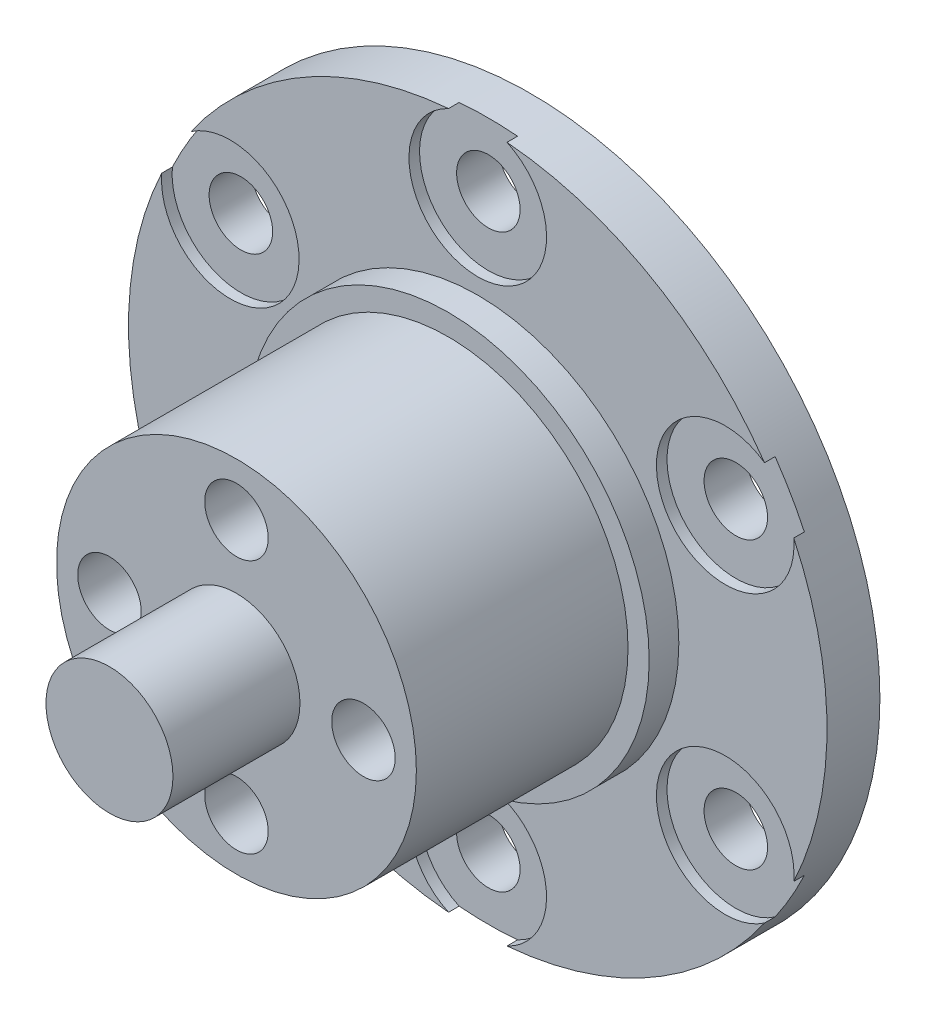
ISO-10303-21;
HEADER;
FILE_DESCRIPTION(('STEP AP214'),'2;1');
FILE_NAME('part.step','',(''),(''),'','','');
FILE_SCHEMA(('AUTOMOTIVE_DESIGN { 1 0 10303 214 1 1 1 1 }'));
ENDSEC;
DATA;
#1=APPLICATION_CONTEXT('core data for automotive mechanical design processes');
#2=APPLICATION_PROTOCOL_DEFINITION('international standard','automotive_design',2000,#1);
#3=PRODUCT_CONTEXT('',#1,'mechanical');
#4=PRODUCT('Part','Part','',(#3));
#5=PRODUCT_RELATED_PRODUCT_CATEGORY('part','',(#4));
#6=PRODUCT_DEFINITION_FORMATION('','',#4);
#7=PRODUCT_DEFINITION_CONTEXT('part definition',#1,'design');
#8=PRODUCT_DEFINITION('design','',#6,#7);
#9=PRODUCT_DEFINITION_SHAPE('','',#8);
#10=(LENGTH_UNIT() NAMED_UNIT(*) SI_UNIT(.MILLI.,.METRE.));
#11=(NAMED_UNIT(*) PLANE_ANGLE_UNIT() SI_UNIT($,.RADIAN.));
#12=(NAMED_UNIT(*) SI_UNIT($,.STERADIAN.) SOLID_ANGLE_UNIT());
#13=UNCERTAINTY_MEASURE_WITH_UNIT(LENGTH_MEASURE(1.E-05),#10,'distance_accuracy_value','');
#14=(GEOMETRIC_REPRESENTATION_CONTEXT(3) GLOBAL_UNCERTAINTY_ASSIGNED_CONTEXT((#13)) GLOBAL_UNIT_ASSIGNED_CONTEXT((#10,
#11,#12)) REPRESENTATION_CONTEXT('',''));
#15=CARTESIAN_POINT('',(0.,0.,0.));
#16=DIRECTION('',(0.,0.,1.));
#17=DIRECTION('',(1.,0.,0.));
#18=AXIS2_PLACEMENT_3D('',#15,#16,#17);
#19=CARTESIAN_POINT('',(11.6913429510899,6.75000000000001,-0.5));
#20=DIRECTION('',(0.,0.,1.));
#21=DIRECTION('',(1.,0.,0.));
#22=AXIS2_PLACEMENT_3D('',#19,#20,#21);
#23=CYLINDRICAL_SURFACE('',#22,1.5);
#24=CARTESIAN_POINT('',(11.6913429510899,6.75000000000001,0.));
#25=DIRECTION('',(0.,0.,1.));
#26=DIRECTION('',(1.,0.,0.));
#27=AXIS2_PLACEMENT_3D('',#24,#25,#26);
#28=CIRCLE('',#27,1.5);
#29=CARTESIAN_POINT('',(13.1913429510899,6.75000000000001,0.));
#30=VERTEX_POINT('',#29);
#31=EDGE_CURVE('E193',#30,#30,#28,.T.);
#32=ORIENTED_EDGE('',*,*,#31,.F.);
#33=EDGE_LOOP('',(#32));
#34=FACE_BOUND('',#33,.T.);
#35=CARTESIAN_POINT('',(11.6913429510899,6.75000000000001,2.));
#36=DIRECTION('',(0.,0.,1.));
#37=DIRECTION('',(1.,0.,0.));
#38=AXIS2_PLACEMENT_3D('',#35,#36,#37);
#39=CIRCLE('',#38,1.5);
#40=CARTESIAN_POINT('',(13.1913429510899,6.75000000000001,2.));
#41=VERTEX_POINT('',#40);
#42=EDGE_CURVE('E45',#41,#41,#39,.F.);
#43=ORIENTED_EDGE('',*,*,#42,.F.);
#44=EDGE_LOOP('',(#43));
#45=FACE_BOUND('',#44,.T.);
#46=ADVANCED_FACE('F41',(#34,#45),#23,.F.);
#47=CARTESIAN_POINT('',(11.6913429510899,-6.75,-0.5));
#48=DIRECTION('',(0.,0.,1.));
#49=DIRECTION('',(1.,0.,0.));
#50=AXIS2_PLACEMENT_3D('',#47,#48,#49);
#51=CYLINDRICAL_SURFACE('',#50,1.5);
#52=CARTESIAN_POINT('',(11.6913429510899,-6.75,0.));
#53=DIRECTION('',(0.,0.,1.));
#54=DIRECTION('',(1.,0.,0.));
#55=AXIS2_PLACEMENT_3D('',#52,#53,#54);
#56=CIRCLE('',#55,1.5);
#57=CARTESIAN_POINT('',(13.1913429510899,-6.75,0.));
#58=VERTEX_POINT('',#57);
#59=EDGE_CURVE('E196',#58,#58,#56,.T.);
#60=ORIENTED_EDGE('',*,*,#59,.F.);
#61=EDGE_LOOP('',(#60));
#62=FACE_BOUND('',#61,.T.);
#63=CARTESIAN_POINT('',(11.6913429510899,-6.75,2.));
#64=DIRECTION('',(0.,0.,1.));
#65=DIRECTION('',(1.,0.,0.));
#66=AXIS2_PLACEMENT_3D('',#63,#64,#65);
#67=CIRCLE('',#66,1.5);
#68=CARTESIAN_POINT('',(13.1913429510899,-6.75,2.));
#69=VERTEX_POINT('',#68);
#70=EDGE_CURVE('E225',#69,#69,#67,.F.);
#71=ORIENTED_EDGE('',*,*,#70,.F.);
#72=EDGE_LOOP('',(#71));
#73=FACE_BOUND('',#72,.T.);
#74=ADVANCED_FACE('F327',(#62,#73),#51,.F.);
#75=CARTESIAN_POINT('',(0.,-13.5,-0.5));
#76=DIRECTION('',(0.,0.,1.));
#77=DIRECTION('',(1.,0.,0.));
#78=AXIS2_PLACEMENT_3D('',#75,#76,#77);
#79=CYLINDRICAL_SURFACE('',#78,1.5);
#80=CARTESIAN_POINT('',(0.,-13.5,0.));
#81=DIRECTION('',(0.,0.,1.));
#82=DIRECTION('',(1.,0.,0.));
#83=AXIS2_PLACEMENT_3D('',#80,#81,#82);
#84=CIRCLE('',#83,1.5);
#85=CARTESIAN_POINT('',(1.5,-13.5,0.));
#86=VERTEX_POINT('',#85);
#87=EDGE_CURVE('E200',#86,#86,#84,.T.);
#88=ORIENTED_EDGE('',*,*,#87,.F.);
#89=EDGE_LOOP('',(#88));
#90=FACE_BOUND('',#89,.T.);
#91=CARTESIAN_POINT('',(0.,-13.5,2.));
#92=DIRECTION('',(0.,0.,1.));
#93=DIRECTION('',(1.,0.,0.));
#94=AXIS2_PLACEMENT_3D('',#91,#92,#93);
#95=CIRCLE('',#94,1.5);
#96=CARTESIAN_POINT('',(1.5,-13.5,2.));
#97=VERTEX_POINT('',#96);
#98=EDGE_CURVE('E222',#97,#97,#95,.F.);
#99=ORIENTED_EDGE('',*,*,#98,.F.);
#100=EDGE_LOOP('',(#99));
#101=FACE_BOUND('',#100,.T.);
#102=ADVANCED_FACE('F333',(#90,#101),#79,.F.);
#103=CARTESIAN_POINT('',(-11.6913429510899,-6.75000000000001,-0.5));
#104=DIRECTION('',(0.,0.,1.));
#105=DIRECTION('',(1.,0.,0.));
#106=AXIS2_PLACEMENT_3D('',#103,#104,#105);
#107=CYLINDRICAL_SURFACE('',#106,1.5);
#108=CARTESIAN_POINT('',(-11.6913429510899,-6.75000000000001,0.));
#109=DIRECTION('',(0.,0.,1.));
#110=DIRECTION('',(1.,0.,0.));
#111=AXIS2_PLACEMENT_3D('',#108,#109,#110);
#112=CIRCLE('',#111,1.5);
#113=CARTESIAN_POINT('',(-10.1913429510899,-6.75000000000001,0.));
#114=VERTEX_POINT('',#113);
#115=EDGE_CURVE('E203',#114,#114,#112,.T.);
#116=ORIENTED_EDGE('',*,*,#115,.F.);
#117=EDGE_LOOP('',(#116));
#118=FACE_BOUND('',#117,.T.);
#119=CARTESIAN_POINT('',(-11.6913429510899,-6.75000000000001,2.));
#120=DIRECTION('',(0.,0.,1.));
#121=DIRECTION('',(1.,0.,0.));
#122=AXIS2_PLACEMENT_3D('',#119,#120,#121);
#123=CIRCLE('',#122,1.5);
#124=CARTESIAN_POINT('',(-10.1913429510899,-6.75000000000001,2.));
#125=VERTEX_POINT('',#124);
#126=EDGE_CURVE('E218',#125,#125,#123,.F.);
#127=ORIENTED_EDGE('',*,*,#126,.F.);
#128=EDGE_LOOP('',(#127));
#129=FACE_BOUND('',#128,.T.);
#130=ADVANCED_FACE('F344',(#118,#129),#107,.F.);
#131=CARTESIAN_POINT('',(-11.6913429510899,6.74999999999999,-0.5));
#132=DIRECTION('',(0.,0.,1.));
#133=DIRECTION('',(1.,0.,0.));
#134=AXIS2_PLACEMENT_3D('',#131,#132,#133);
#135=CYLINDRICAL_SURFACE('',#134,1.5);
#136=CARTESIAN_POINT('',(-11.6913429510899,6.74999999999999,0.));
#137=DIRECTION('',(0.,0.,1.));
#138=DIRECTION('',(1.,0.,0.));
#139=AXIS2_PLACEMENT_3D('',#136,#137,#138);
#140=CIRCLE('',#139,1.5);
#141=CARTESIAN_POINT('',(-10.1913429510899,6.74999999999999,0.));
#142=VERTEX_POINT('',#141);
#143=EDGE_CURVE('E206',#142,#142,#140,.T.);
#144=ORIENTED_EDGE('',*,*,#143,.F.);
#145=EDGE_LOOP('',(#144));
#146=FACE_BOUND('',#145,.T.);
#147=CARTESIAN_POINT('',(-11.6913429510899,6.74999999999999,2.));
#148=DIRECTION('',(0.,0.,1.));
#149=DIRECTION('',(1.,0.,0.));
#150=AXIS2_PLACEMENT_3D('',#147,#148,#149);
#151=CIRCLE('',#150,1.5);
#152=CARTESIAN_POINT('',(-10.1913429510899,6.74999999999999,2.));
#153=VERTEX_POINT('',#152);
#154=EDGE_CURVE('E214',#153,#153,#151,.F.);
#155=ORIENTED_EDGE('',*,*,#154,.F.);
#156=EDGE_LOOP('',(#155));
#157=FACE_BOUND('',#156,.T.);
#158=ADVANCED_FACE('F339',(#146,#157),#135,.F.);
#159=CARTESIAN_POINT('',(0.,13.5,-0.5));
#160=DIRECTION('',(0.,0.,1.));
#161=DIRECTION('',(1.,0.,0.));
#162=AXIS2_PLACEMENT_3D('',#159,#160,#161);
#163=CYLINDRICAL_SURFACE('',#162,1.5);
#164=CARTESIAN_POINT('',(0.,13.5,0.));
#165=DIRECTION('',(0.,0.,1.));
#166=DIRECTION('',(1.,0.,0.));
#167=AXIS2_PLACEMENT_3D('',#164,#165,#166);
#168=CIRCLE('',#167,1.5);
#169=CARTESIAN_POINT('',(1.5,13.5,0.));
#170=VERTEX_POINT('',#169);
#171=EDGE_CURVE('E190',#170,#170,#168,.T.);
#172=ORIENTED_EDGE('',*,*,#171,.F.);
#173=EDGE_LOOP('',(#172));
#174=FACE_BOUND('',#173,.T.);
#175=CARTESIAN_POINT('',(0.,13.5,2.));
#176=DIRECTION('',(0.,0.,1.));
#177=DIRECTION('',(1.,0.,0.));
#178=AXIS2_PLACEMENT_3D('',#175,#176,#177);
#179=CIRCLE('',#178,1.5);
#180=CARTESIAN_POINT('',(1.5,13.5,2.));
#181=VERTEX_POINT('',#180);
#182=EDGE_CURVE('E211',#181,#181,#179,.F.);
#183=ORIENTED_EDGE('',*,*,#182,.F.);
#184=EDGE_LOOP('',(#183));
#185=FACE_BOUND('',#184,.T.);
#186=ADVANCED_FACE('F325',(#174,#185),#163,.F.);
#187=CARTESIAN_POINT('',(0.,0.,2.5));
#188=DIRECTION('',(0.,0.,-1.));
#189=DIRECTION('',(-1.,0.,0.));
#190=AXIS2_PLACEMENT_3D('',#187,#188,#189);
#191=CYLINDRICAL_SURFACE('',#190,16.5);
#192=CARTESIAN_POINT('',(0.,0.,2.));
#193=DIRECTION('',(0.,0.,1.));
#194=DIRECTION('',(1.,0.,0.));
#195=AXIS2_PLACEMENT_3D('',#192,#193,#194);
#196=CIRCLE('',#195,16.5);
#197=CARTESIAN_POINT('',(1.38071475781764,16.4421296296296,2.));
#198=VERTEX_POINT('',#197);
#199=CARTESIAN_POINT('',(-1.38071475781764,16.4421296296296,2.));
#200=VERTEX_POINT('',#199);
#201=EDGE_CURVE('E166',#198,#200,#196,.T.);
#202=ORIENTED_EDGE('',*,*,#201,.F.);
#203=DIRECTION('',(0.,0.,1.));
#204=VECTOR('',#203,1.);
#205=CARTESIAN_POINT('',(1.38071475781765,16.4421296296296,2.25));
#206=LINE('',#205,#204);
#207=CARTESIAN_POINT('',(1.38071475781765,16.4421296296296,2.5));
#208=VERTEX_POINT('',#207);
#209=EDGE_CURVE('E149',#198,#208,#206,.T.);
#210=ORIENTED_EDGE('',*,*,#209,.T.);
#211=CARTESIAN_POINT('',(0.,0.,2.5));
#212=DIRECTION('',(0.,0.,1.));
#213=DIRECTION('',(1.,0.,0.));
#214=AXIS2_PLACEMENT_3D('',#211,#212,#213);
#215=CIRCLE('',#214,16.5);
#216=CARTESIAN_POINT('',(13.5489445726673,9.41679887046495,2.5));
#217=VERTEX_POINT('',#216);
#218=EDGE_CURVE('E165',#217,#208,#215,.T.);
#219=ORIENTED_EDGE('',*,*,#218,.F.);
#220=DIRECTION('',(0.,0.,1.));
#221=VECTOR('',#220,1.);
#222=CARTESIAN_POINT('',(13.5489445726673,9.41679887046496,2.25));
#223=LINE('',#222,#221);
#224=CARTESIAN_POINT('',(13.5489445726673,9.41679887046497,2.));
#225=VERTEX_POINT('',#224);
#226=EDGE_CURVE('E240',#217,#225,#223,.F.);
#227=ORIENTED_EDGE('',*,*,#226,.T.);
#228=CARTESIAN_POINT('',(0.,0.,2.));
#229=DIRECTION('',(0.,0.,1.));
#230=DIRECTION('',(1.,0.,0.));
#231=AXIS2_PLACEMENT_3D('',#228,#229,#230);
#232=CIRCLE('',#231,16.5);
#233=CARTESIAN_POINT('',(14.9296593304849,7.02533075916467,2.));
#234=VERTEX_POINT('',#233);
#235=EDGE_CURVE('E238',#234,#225,#232,.T.);
#236=ORIENTED_EDGE('',*,*,#235,.F.);
#237=DIRECTION('',(0.,0.,1.));
#238=VECTOR('',#237,1.);
#239=CARTESIAN_POINT('',(14.9296593304849,7.02533075916469,2.25));
#240=LINE('',#239,#238);
#241=CARTESIAN_POINT('',(14.9296593304849,7.02533075916469,2.5));
#242=VERTEX_POINT('',#241);
#243=EDGE_CURVE('E242',#234,#242,#240,.T.);
#244=ORIENTED_EDGE('',*,*,#243,.T.);
#245=CARTESIAN_POINT('',(14.9296593304849,-7.02533075916464,2.5));
#246=VERTEX_POINT('',#245);
#247=EDGE_CURVE('E176',#246,#242,#215,.T.);
#248=ORIENTED_EDGE('',*,*,#247,.F.);
#249=DIRECTION('',(0.,0.,1.));
#250=VECTOR('',#249,1.);
#251=CARTESIAN_POINT('',(14.9296593304849,-7.02533075916464,2.25));
#252=LINE('',#251,#250);
#253=CARTESIAN_POINT('',(14.9296593304849,-7.02533075916465,2.));
#254=VERTEX_POINT('',#253);
#255=EDGE_CURVE('E58',#246,#254,#252,.F.);
#256=ORIENTED_EDGE('',*,*,#255,.T.);
#257=CARTESIAN_POINT('',(0.,0.,2.));
#258=DIRECTION('',(0.,0.,1.));
#259=DIRECTION('',(1.,0.,0.));
#260=AXIS2_PLACEMENT_3D('',#257,#258,#259);
#261=CIRCLE('',#260,16.5);
#262=CARTESIAN_POINT('',(13.5489445726673,-9.41679887046497,2.));
#263=VERTEX_POINT('',#262);
#264=EDGE_CURVE('E227',#263,#254,#261,.T.);
#265=ORIENTED_EDGE('',*,*,#264,.F.);
#266=DIRECTION('',(0.,0.,1.));
#267=VECTOR('',#266,1.);
#268=CARTESIAN_POINT('',(13.5489445726673,-9.41679887046498,2.25));
#269=LINE('',#268,#267);
#270=CARTESIAN_POINT('',(13.5489445726673,-9.41679887046498,2.5));
#271=VERTEX_POINT('',#270);
#272=EDGE_CURVE('E246',#263,#271,#269,.T.);
#273=ORIENTED_EDGE('',*,*,#272,.T.);
#274=CARTESIAN_POINT('',(1.38071475781766,-16.4421296296296,2.5));
#275=VERTEX_POINT('',#274);
#276=EDGE_CURVE('E181',#275,#271,#215,.T.);
#277=ORIENTED_EDGE('',*,*,#276,.F.);
#278=DIRECTION('',(0.,0.,1.));
#279=VECTOR('',#278,1.);
#280=CARTESIAN_POINT('',(1.38071475781766,-16.4421296296296,2.25));
#281=LINE('',#280,#279);
#282=CARTESIAN_POINT('',(1.38071475781764,-16.4421296296296,2.));
#283=VERTEX_POINT('',#282);
#284=EDGE_CURVE('E66',#275,#283,#281,.F.);
#285=ORIENTED_EDGE('',*,*,#284,.T.);
#286=CARTESIAN_POINT('',(0.,0.,2.));
#287=DIRECTION('',(0.,0.,1.));
#288=DIRECTION('',(1.,0.,0.));
#289=AXIS2_PLACEMENT_3D('',#286,#287,#288);
#290=CIRCLE('',#289,16.5);
#291=CARTESIAN_POINT('',(-1.38071475781763,-16.4421296296296,2.));
#292=VERTEX_POINT('',#291);
#293=EDGE_CURVE('E224',#292,#283,#290,.T.);
#294=ORIENTED_EDGE('',*,*,#293,.F.);
#295=DIRECTION('',(0.,0.,1.));
#296=VECTOR('',#295,1.);
#297=CARTESIAN_POINT('',(-1.38071475781765,-16.4421296296296,2.25));
#298=LINE('',#297,#296);
#299=CARTESIAN_POINT('',(-1.38071475781765,-16.4421296296296,2.5));
#300=VERTEX_POINT('',#299);
#301=EDGE_CURVE('E250',#292,#300,#298,.T.);
#302=ORIENTED_EDGE('',*,*,#301,.T.);
#303=CARTESIAN_POINT('',(-13.5489445726672,-9.41679887046499,2.5));
#304=VERTEX_POINT('',#303);
#305=EDGE_CURVE('E185',#304,#300,#215,.T.);
#306=ORIENTED_EDGE('',*,*,#305,.F.);
#307=DIRECTION('',(0.,0.,1.));
#308=VECTOR('',#307,1.);
#309=CARTESIAN_POINT('',(-13.5489445726672,-9.41679887046499,2.25));
#310=LINE('',#309,#308);
#311=CARTESIAN_POINT('',(-13.5489445726673,-9.41679887046498,2.));
#312=VERTEX_POINT('',#311);
#313=EDGE_CURVE('E253',#304,#312,#310,.F.);
#314=ORIENTED_EDGE('',*,*,#313,.T.);
#315=CARTESIAN_POINT('',(0.,0.,2.));
#316=DIRECTION('',(0.,0.,1.));
#317=DIRECTION('',(1.,0.,0.));
#318=AXIS2_PLACEMENT_3D('',#315,#316,#317);
#319=CIRCLE('',#318,16.5);
#320=CARTESIAN_POINT('',(-14.9296593304849,-7.02533075916467,2.));
#321=VERTEX_POINT('',#320);
#322=EDGE_CURVE('E221',#321,#312,#319,.T.);
#323=ORIENTED_EDGE('',*,*,#322,.F.);
#324=DIRECTION('',(0.,0.,1.));
#325=VECTOR('',#324,1.);
#326=CARTESIAN_POINT('',(-14.9296593304849,-7.02533075916465,2.25));
#327=LINE('',#326,#325);
#328=CARTESIAN_POINT('',(-14.9296593304849,-7.02533075916465,2.5));
#329=VERTEX_POINT('',#328);
#330=EDGE_CURVE('E256',#321,#329,#327,.T.);
#331=ORIENTED_EDGE('',*,*,#330,.T.);
#332=CARTESIAN_POINT('',(-14.9296593304849,7.02533075916463,2.5));
#333=VERTEX_POINT('',#332);
#334=EDGE_CURVE('E179',#333,#329,#215,.T.);
#335=ORIENTED_EDGE('',*,*,#334,.F.);
#336=DIRECTION('',(0.,0.,1.));
#337=VECTOR('',#336,1.);
#338=CARTESIAN_POINT('',(-14.9296593304849,7.02533075916463,2.25));
#339=LINE('',#338,#337);
#340=CARTESIAN_POINT('',(-14.9296593304849,7.02533075916465,2.));
#341=VERTEX_POINT('',#340);
#342=EDGE_CURVE('E259',#333,#341,#339,.F.);
#343=ORIENTED_EDGE('',*,*,#342,.T.);
#344=CARTESIAN_POINT('',(0.,0.,2.));
#345=DIRECTION('',(0.,0.,1.));
#346=DIRECTION('',(1.,0.,0.));
#347=AXIS2_PLACEMENT_3D('',#344,#345,#346);
#348=CIRCLE('',#347,16.5);
#349=CARTESIAN_POINT('',(-13.5489445726673,9.41679887046495,2.));
#350=VERTEX_POINT('',#349);
#351=EDGE_CURVE('E217',#350,#341,#348,.T.);
#352=ORIENTED_EDGE('',*,*,#351,.F.);
#353=DIRECTION('',(0.,0.,1.));
#354=VECTOR('',#353,1.);
#355=CARTESIAN_POINT('',(-13.5489445726673,9.41679887046497,2.25));
#356=LINE('',#355,#354);
#357=CARTESIAN_POINT('',(-13.5489445726673,9.41679887046497,2.5));
#358=VERTEX_POINT('',#357);
#359=EDGE_CURVE('E262',#350,#358,#356,.T.);
#360=ORIENTED_EDGE('',*,*,#359,.T.);
#361=CARTESIAN_POINT('',(-1.38071475781766,16.4421296296296,2.5));
#362=VERTEX_POINT('',#361);
#363=EDGE_CURVE('E174',#362,#358,#215,.T.);
#364=ORIENTED_EDGE('',*,*,#363,.F.);
#365=DIRECTION('',(0.,0.,1.));
#366=VECTOR('',#365,1.);
#367=CARTESIAN_POINT('',(-1.38071475781765,16.4421296296296,2.25));
#368=LINE('',#367,#366);
#369=EDGE_CURVE('E152',#362,#200,#368,.F.);
#370=ORIENTED_EDGE('',*,*,#369,.T.);
#371=EDGE_LOOP('',(#202,#210,#219,#227,#236,#244,#248,#256,#265,#273,#277,#285,#294,#302,#306,
#314,#323,#331,#335,#343,#352,#360,#364,#370));
#372=FACE_BOUND('',#371,.T.);
#373=CARTESIAN_POINT('',(0.,0.,0.));
#374=DIRECTION('',(0.,0.,1.));
#375=DIRECTION('',(1.,0.,0.));
#376=AXIS2_PLACEMENT_3D('',#373,#374,#375);
#377=CIRCLE('',#376,16.5);
#378=CARTESIAN_POINT('',(16.5,0.,0.));
#379=VERTEX_POINT('',#378);
#380=EDGE_CURVE('E182',#379,#379,#377,.T.);
#381=ORIENTED_EDGE('',*,*,#380,.T.);
#382=EDGE_LOOP('',(#381));
#383=FACE_BOUND('',#382,.T.);
#384=ADVANCED_FACE('F43',(#372,#383),#191,.T.);
#385=CARTESIAN_POINT('',(0.,0.,2.5));
#386=DIRECTION('',(0.,0.,1.));
#387=DIRECTION('',(1.,0.,0.));
#388=AXIS2_PLACEMENT_3D('',#385,#386,#387);
#389=PLANE('',#388);
#390=CARTESIAN_POINT('',(0.,13.5,2.5));
#391=DIRECTION('',(0.,0.,1.));
#392=DIRECTION('',(1.,0.,0.));
#393=AXIS2_PLACEMENT_3D('',#390,#391,#392);
#394=CIRCLE('',#393,3.25);
#395=EDGE_CURVE('E145',#362,#208,#394,.T.);
#396=ORIENTED_EDGE('',*,*,#395,.F.);
#397=ORIENTED_EDGE('',*,*,#363,.T.);
#398=CARTESIAN_POINT('',(-11.6913429510899,6.74999999999999,2.5));
#399=DIRECTION('',(0.,0.,1.));
#400=DIRECTION('',(1.,0.,0.));
#401=AXIS2_PLACEMENT_3D('',#398,#399,#400);
#402=CIRCLE('',#401,3.25);
#403=EDGE_CURVE('E376',#333,#358,#402,.T.);
#404=ORIENTED_EDGE('',*,*,#403,.F.);
#405=ORIENTED_EDGE('',*,*,#334,.T.);
#406=CARTESIAN_POINT('',(-11.6913429510899,-6.75000000000001,2.5));
#407=DIRECTION('',(0.,0.,1.));
#408=DIRECTION('',(1.,0.,0.));
#409=AXIS2_PLACEMENT_3D('',#406,#407,#408);
#410=CIRCLE('',#409,3.25);
#411=EDGE_CURVE('E369',#304,#329,#410,.T.);
#412=ORIENTED_EDGE('',*,*,#411,.F.);
#413=ORIENTED_EDGE('',*,*,#305,.T.);
#414=CARTESIAN_POINT('',(0.,-13.5,2.5));
#415=DIRECTION('',(0.,0.,1.));
#416=DIRECTION('',(1.,0.,0.));
#417=AXIS2_PLACEMENT_3D('',#414,#415,#416);
#418=CIRCLE('',#417,3.25);
#419=EDGE_CURVE('E368',#275,#300,#418,.T.);
#420=ORIENTED_EDGE('',*,*,#419,.F.);
#421=ORIENTED_EDGE('',*,*,#276,.T.);
#422=CARTESIAN_POINT('',(11.6913429510899,-6.75,2.5));
#423=DIRECTION('',(0.,0.,1.));
#424=DIRECTION('',(1.,0.,0.));
#425=AXIS2_PLACEMENT_3D('',#422,#423,#424);
#426=CIRCLE('',#425,3.25);
#427=EDGE_CURVE('E395',#246,#271,#426,.T.);
#428=ORIENTED_EDGE('',*,*,#427,.F.);
#429=ORIENTED_EDGE('',*,*,#247,.T.);
#430=CARTESIAN_POINT('',(11.6913429510899,6.75000000000001,2.5));
#431=DIRECTION('',(0.,0.,1.));
#432=DIRECTION('',(1.,0.,0.));
#433=AXIS2_PLACEMENT_3D('',#430,#431,#432);
#434=CIRCLE('',#433,3.25);
#435=EDGE_CURVE('E173',#217,#242,#434,.T.);
#436=ORIENTED_EDGE('',*,*,#435,.F.);
#437=ORIENTED_EDGE('',*,*,#218,.T.);
#438=EDGE_LOOP('',(#396,#397,#404,#405,#412,#413,#420,#421,#428,#429,#436,#437));
#439=FACE_BOUND('',#438,.T.);
#440=CARTESIAN_POINT('',(0.,0.,2.5));
#441=DIRECTION('',(0.,0.,1.));
#442=DIRECTION('',(1.,0.,0.));
#443=AXIS2_PLACEMENT_3D('',#440,#441,#442);
#444=CIRCLE('',#443,9.5);
#445=CARTESIAN_POINT('',(9.5,0.,2.5));
#446=VERTEX_POINT('',#445);
#447=EDGE_CURVE('E50',#446,#446,#444,.T.);
#448=ORIENTED_EDGE('',*,*,#447,.F.);
#449=EDGE_LOOP('',(#448));
#450=FACE_BOUND('',#449,.T.);
#451=ADVANCED_FACE('F170',(#439,#450),#389,.T.);
#452=CARTESIAN_POINT('',(0.,0.,0.));
#453=DIRECTION('',(0.,0.,1.));
#454=DIRECTION('',(1.,0.,0.));
#455=AXIS2_PLACEMENT_3D('',#452,#453,#454);
#456=PLANE('',#455);
#457=ORIENTED_EDGE('',*,*,#171,.T.);
#458=EDGE_LOOP('',(#457));
#459=FACE_BOUND('',#458,.T.);
#460=ORIENTED_EDGE('',*,*,#143,.T.);
#461=EDGE_LOOP('',(#460));
#462=FACE_BOUND('',#461,.T.);
#463=ORIENTED_EDGE('',*,*,#115,.T.);
#464=EDGE_LOOP('',(#463));
#465=FACE_BOUND('',#464,.T.);
#466=ORIENTED_EDGE('',*,*,#87,.T.);
#467=EDGE_LOOP('',(#466));
#468=FACE_BOUND('',#467,.T.);
#469=ORIENTED_EDGE('',*,*,#59,.T.);
#470=EDGE_LOOP('',(#469));
#471=FACE_BOUND('',#470,.T.);
#472=ORIENTED_EDGE('',*,*,#31,.T.);
#473=EDGE_LOOP('',(#472));
#474=FACE_BOUND('',#473,.T.);
#475=ORIENTED_EDGE('',*,*,#380,.F.);
#476=EDGE_LOOP('',(#475));
#477=FACE_BOUND('',#476,.T.);
#478=ADVANCED_FACE('F315',(#459,#462,#465,#468,#471,#474,#477),#456,.F.);
#479=CARTESIAN_POINT('',(0.,0.,3.9));
#480=DIRECTION('',(0.,0.,-1.));
#481=DIRECTION('',(-1.,0.,0.));
#482=AXIS2_PLACEMENT_3D('',#479,#480,#481);
#483=CYLINDRICAL_SURFACE('',#482,9.5);
#484=CARTESIAN_POINT('',(0.,0.,3.9));
#485=DIRECTION('',(0.,0.,1.));
#486=DIRECTION('',(1.,0.,0.));
#487=AXIS2_PLACEMENT_3D('',#484,#485,#486);
#488=CIRCLE('',#487,9.5);
#489=CARTESIAN_POINT('',(9.5,0.,3.9));
#490=VERTEX_POINT('',#489);
#491=EDGE_CURVE('E187',#490,#490,#488,.T.);
#492=ORIENTED_EDGE('',*,*,#491,.F.);
#493=EDGE_LOOP('',(#492));
#494=FACE_BOUND('',#493,.T.);
#495=ORIENTED_EDGE('',*,*,#447,.T.);
#496=EDGE_LOOP('',(#495));
#497=FACE_BOUND('',#496,.T.);
#498=ADVANCED_FACE('F309',(#494,#497),#483,.T.);
#499=CARTESIAN_POINT('',(0.,0.,3.9));
#500=DIRECTION('',(0.,0.,1.));
#501=DIRECTION('',(1.,0.,0.));
#502=AXIS2_PLACEMENT_3D('',#499,#500,#501);
#503=PLANE('',#502);
#504=CARTESIAN_POINT('',(0.,0.,3.9));
#505=DIRECTION('',(0.,0.,1.));
#506=DIRECTION('',(1.,0.,0.));
#507=AXIS2_PLACEMENT_3D('',#504,#505,#506);
#508=CIRCLE('',#507,8.5);
#509=CARTESIAN_POINT('',(8.5,0.,3.9));
#510=VERTEX_POINT('',#509);
#511=EDGE_CURVE('E11',#510,#510,#508,.T.);
#512=ORIENTED_EDGE('',*,*,#511,.F.);
#513=EDGE_LOOP('',(#512));
#514=FACE_BOUND('',#513,.T.);
#515=ORIENTED_EDGE('',*,*,#491,.T.);
#516=EDGE_LOOP('',(#515));
#517=FACE_BOUND('',#516,.T.);
#518=ADVANCED_FACE('F303',(#514,#517),#503,.T.);
#519=CARTESIAN_POINT('',(0.,0.,13.9));
#520=DIRECTION('',(0.,0.,-1.));
#521=DIRECTION('',(-1.,0.,0.));
#522=AXIS2_PLACEMENT_3D('',#519,#520,#521);
#523=CYLINDRICAL_SURFACE('',#522,8.5);
#524=CARTESIAN_POINT('',(0.,0.,13.9));
#525=DIRECTION('',(0.,0.,1.));
#526=DIRECTION('',(1.,0.,0.));
#527=AXIS2_PLACEMENT_3D('',#524,#525,#526);
#528=CIRCLE('',#527,8.5);
#529=CARTESIAN_POINT('',(8.5,0.,13.9));
#530=VERTEX_POINT('',#529);
#531=EDGE_CURVE('E197',#530,#530,#528,.T.);
#532=ORIENTED_EDGE('',*,*,#531,.F.);
#533=EDGE_LOOP('',(#532));
#534=FACE_BOUND('',#533,.T.);
#535=ORIENTED_EDGE('',*,*,#511,.T.);
#536=EDGE_LOOP('',(#535));
#537=FACE_BOUND('',#536,.T.);
#538=ADVANCED_FACE('F300',(#534,#537),#523,.T.);
#539=CARTESIAN_POINT('',(0.,0.,13.9));
#540=DIRECTION('',(0.,0.,1.));
#541=DIRECTION('',(1.,0.,0.));
#542=AXIS2_PLACEMENT_3D('',#539,#540,#541);
#543=PLANE('',#542);
#544=CARTESIAN_POINT('',(0.,0.,13.9));
#545=DIRECTION('',(0.,0.,1.));
#546=DIRECTION('',(1.,0.,0.));
#547=AXIS2_PLACEMENT_3D('',#544,#545,#546);
#548=CIRCLE('',#547,3.);
#549=CARTESIAN_POINT('',(3.,0.,13.9));
#550=VERTEX_POINT('',#549);
#551=EDGE_CURVE('E167',#550,#550,#548,.T.);
#552=ORIENTED_EDGE('',*,*,#551,.F.);
#553=EDGE_LOOP('',(#552));
#554=FACE_BOUND('',#553,.T.);
#555=CARTESIAN_POINT('',(6.,0.,13.9));
#556=DIRECTION('',(0.,0.,1.));
#557=DIRECTION('',(1.,0.,0.));
#558=AXIS2_PLACEMENT_3D('',#555,#556,#557);
#559=CIRCLE('',#558,1.49999999999999);
#560=CARTESIAN_POINT('',(7.49999999999999,0.,13.9));
#561=VERTEX_POINT('',#560);
#562=EDGE_CURVE('E269',#561,#561,#559,.T.);
#563=ORIENTED_EDGE('',*,*,#562,.F.);
#564=EDGE_LOOP('',(#563));
#565=FACE_BOUND('',#564,.T.);
#566=CARTESIAN_POINT('',(0.,-6.,13.9));
#567=DIRECTION('',(0.,0.,1.));
#568=DIRECTION('',(1.,0.,0.));
#569=AXIS2_PLACEMENT_3D('',#566,#567,#568);
#570=CIRCLE('',#569,1.49999999999999);
#571=CARTESIAN_POINT('',(1.49999999999999,-6.,13.9));
#572=VERTEX_POINT('',#571);
#573=EDGE_CURVE('E277',#572,#572,#570,.T.);
#574=ORIENTED_EDGE('',*,*,#573,.F.);
#575=EDGE_LOOP('',(#574));
#576=FACE_BOUND('',#575,.T.);
#577=CARTESIAN_POINT('',(-6.,0.,13.9));
#578=DIRECTION('',(0.,0.,1.));
#579=DIRECTION('',(1.,0.,0.));
#580=AXIS2_PLACEMENT_3D('',#577,#578,#579);
#581=CIRCLE('',#580,1.49999999999999);
#582=CARTESIAN_POINT('',(-4.50000000000001,0.,13.9));
#583=VERTEX_POINT('',#582);
#584=EDGE_CURVE('E283',#583,#583,#581,.T.);
#585=ORIENTED_EDGE('',*,*,#584,.F.);
#586=EDGE_LOOP('',(#585));
#587=FACE_BOUND('',#586,.T.);
#588=CARTESIAN_POINT('',(0.,6.,13.9));
#589=DIRECTION('',(0.,0.,1.));
#590=DIRECTION('',(1.,0.,0.));
#591=AXIS2_PLACEMENT_3D('',#588,#589,#590);
#592=CIRCLE('',#591,1.49999999999999);
#593=CARTESIAN_POINT('',(1.49999999999999,6.,13.9));
#594=VERTEX_POINT('',#593);
#595=EDGE_CURVE('E289',#594,#594,#592,.T.);
#596=ORIENTED_EDGE('',*,*,#595,.F.);
#597=EDGE_LOOP('',(#596));
#598=FACE_BOUND('',#597,.T.);
#599=ORIENTED_EDGE('',*,*,#531,.T.);
#600=EDGE_LOOP('',(#599));
#601=FACE_BOUND('',#600,.T.);
#602=ADVANCED_FACE('F298',(#554,#565,#576,#587,#598,#601),#543,.T.);
#603=CARTESIAN_POINT('',(0.,6.,6.39999999999999));
#604=DIRECTION('',(0.,0.,1.));
#605=DIRECTION('',(1.,0.,0.));
#606=AXIS2_PLACEMENT_3D('',#603,#604,#605);
#607=CONICAL_SURFACE('',#606,1.49999999999999,1.02974425867665);
#608=CARTESIAN_POINT('',(0.,6.,5.49870907145866));
#609=VERTEX_POINT('',#608);
#610=VERTEX_LOOP('',#609);
#611=FACE_BOUND('',#610,.T.);
#612=CARTESIAN_POINT('',(0.,6.,6.39999999999999));
#613=DIRECTION('',(0.,0.,1.));
#614=DIRECTION('',(1.,0.,0.));
#615=AXIS2_PLACEMENT_3D('',#612,#613,#614);
#616=CIRCLE('',#615,1.49999999999999);
#617=CARTESIAN_POINT('',(1.49999999999999,6.,6.39999999999999));
#618=VERTEX_POINT('',#617);
#619=EDGE_CURVE('E292',#618,#618,#616,.T.);
#620=ORIENTED_EDGE('',*,*,#619,.T.);
#621=EDGE_LOOP('',(#620));
#622=FACE_BOUND('',#621,.T.);
#623=ADVANCED_FACE('F469',(#611,#622),#607,.F.);
#624=CARTESIAN_POINT('',(0.,6.,13.9));
#625=DIRECTION('',(0.,0.,1.));
#626=DIRECTION('',(1.,0.,0.));
#627=AXIS2_PLACEMENT_3D('',#624,#625,#626);
#628=CYLINDRICAL_SURFACE('',#627,1.49999999999999);
#629=ORIENTED_EDGE('',*,*,#619,.F.);
#630=EDGE_LOOP('',(#629));
#631=FACE_BOUND('',#630,.T.);
#632=ORIENTED_EDGE('',*,*,#595,.T.);
#633=EDGE_LOOP('',(#632));
#634=FACE_BOUND('',#633,.T.);
#635=ADVANCED_FACE('F465',(#631,#634),#628,.F.);
#636=CARTESIAN_POINT('',(-6.,0.,6.39999999999999));
#637=DIRECTION('',(0.,0.,1.));
#638=DIRECTION('',(1.,0.,0.));
#639=AXIS2_PLACEMENT_3D('',#636,#637,#638);
#640=CONICAL_SURFACE('',#639,1.49999999999999,1.02974425867665);
#641=CARTESIAN_POINT('',(-6.,0.,5.49870907145866));
#642=VERTEX_POINT('',#641);
#643=VERTEX_LOOP('',#642);
#644=FACE_BOUND('',#643,.T.);
#645=CARTESIAN_POINT('',(-6.,0.,6.39999999999999));
#646=DIRECTION('',(0.,0.,1.));
#647=DIRECTION('',(1.,0.,0.));
#648=AXIS2_PLACEMENT_3D('',#645,#646,#647);
#649=CIRCLE('',#648,1.49999999999999);
#650=CARTESIAN_POINT('',(-4.50000000000001,0.,6.39999999999999));
#651=VERTEX_POINT('',#650);
#652=EDGE_CURVE('E286',#651,#651,#649,.T.);
#653=ORIENTED_EDGE('',*,*,#652,.T.);
#654=EDGE_LOOP('',(#653));
#655=FACE_BOUND('',#654,.T.);
#656=ADVANCED_FACE('F461',(#644,#655),#640,.F.);
#657=CARTESIAN_POINT('',(-6.,0.,13.9));
#658=DIRECTION('',(0.,0.,1.));
#659=DIRECTION('',(1.,0.,0.));
#660=AXIS2_PLACEMENT_3D('',#657,#658,#659);
#661=CYLINDRICAL_SURFACE('',#660,1.49999999999999);
#662=ORIENTED_EDGE('',*,*,#652,.F.);
#663=EDGE_LOOP('',(#662));
#664=FACE_BOUND('',#663,.T.);
#665=ORIENTED_EDGE('',*,*,#584,.T.);
#666=EDGE_LOOP('',(#665));
#667=FACE_BOUND('',#666,.T.);
#668=ADVANCED_FACE('F457',(#664,#667),#661,.F.);
#669=CARTESIAN_POINT('',(0.,-6.,6.39999999999999));
#670=DIRECTION('',(0.,0.,1.));
#671=DIRECTION('',(1.,0.,0.));
#672=AXIS2_PLACEMENT_3D('',#669,#670,#671);
#673=CONICAL_SURFACE('',#672,1.49999999999999,1.02974425867665);
#674=CARTESIAN_POINT('',(0.,-6.,5.49870907145866));
#675=VERTEX_POINT('',#674);
#676=VERTEX_LOOP('',#675);
#677=FACE_BOUND('',#676,.T.);
#678=CARTESIAN_POINT('',(0.,-6.,6.39999999999999));
#679=DIRECTION('',(0.,0.,1.));
#680=DIRECTION('',(1.,0.,0.));
#681=AXIS2_PLACEMENT_3D('',#678,#679,#680);
#682=CIRCLE('',#681,1.49999999999999);
#683=CARTESIAN_POINT('',(1.49999999999999,-6.,6.39999999999999));
#684=VERTEX_POINT('',#683);
#685=EDGE_CURVE('E280',#684,#684,#682,.T.);
#686=ORIENTED_EDGE('',*,*,#685,.T.);
#687=EDGE_LOOP('',(#686));
#688=FACE_BOUND('',#687,.T.);
#689=ADVANCED_FACE('F453',(#677,#688),#673,.F.);
#690=CARTESIAN_POINT('',(0.,-6.,13.9));
#691=DIRECTION('',(0.,0.,1.));
#692=DIRECTION('',(1.,0.,0.));
#693=AXIS2_PLACEMENT_3D('',#690,#691,#692);
#694=CYLINDRICAL_SURFACE('',#693,1.49999999999999);
#695=ORIENTED_EDGE('',*,*,#685,.F.);
#696=EDGE_LOOP('',(#695));
#697=FACE_BOUND('',#696,.T.);
#698=ORIENTED_EDGE('',*,*,#573,.T.);
#699=EDGE_LOOP('',(#698));
#700=FACE_BOUND('',#699,.T.);
#701=ADVANCED_FACE('F449',(#697,#700),#694,.F.);
#702=CARTESIAN_POINT('',(6.,0.,6.39999999999999));
#703=DIRECTION('',(0.,0.,1.));
#704=DIRECTION('',(1.,0.,0.));
#705=AXIS2_PLACEMENT_3D('',#702,#703,#704);
#706=CONICAL_SURFACE('',#705,1.49999999999999,1.02974425867665);
#707=CARTESIAN_POINT('',(6.,0.,5.49870907145866));
#708=VERTEX_POINT('',#707);
#709=VERTEX_LOOP('',#708);
#710=FACE_BOUND('',#709,.T.);
#711=CARTESIAN_POINT('',(6.,0.,6.39999999999999));
#712=DIRECTION('',(0.,0.,1.));
#713=DIRECTION('',(1.,0.,0.));
#714=AXIS2_PLACEMENT_3D('',#711,#712,#713);
#715=CIRCLE('',#714,1.49999999999999);
#716=CARTESIAN_POINT('',(7.49999999999999,0.,6.39999999999999));
#717=VERTEX_POINT('',#716);
#718=EDGE_CURVE('E274',#717,#717,#715,.T.);
#719=ORIENTED_EDGE('',*,*,#718,.T.);
#720=EDGE_LOOP('',(#719));
#721=FACE_BOUND('',#720,.T.);
#722=ADVANCED_FACE('F445',(#710,#721),#706,.F.);
#723=CARTESIAN_POINT('',(6.,0.,13.9));
#724=DIRECTION('',(0.,0.,1.));
#725=DIRECTION('',(1.,0.,0.));
#726=AXIS2_PLACEMENT_3D('',#723,#724,#725);
#727=CYLINDRICAL_SURFACE('',#726,1.49999999999999);
#728=ORIENTED_EDGE('',*,*,#718,.F.);
#729=EDGE_LOOP('',(#728));
#730=FACE_BOUND('',#729,.T.);
#731=ORIENTED_EDGE('',*,*,#562,.T.);
#732=EDGE_LOOP('',(#731));
#733=FACE_BOUND('',#732,.T.);
#734=ADVANCED_FACE('F441',(#730,#733),#727,.F.);
#735=CARTESIAN_POINT('',(0.,0.,19.9));
#736=DIRECTION('',(0.,0.,-1.));
#737=DIRECTION('',(-1.,0.,0.));
#738=AXIS2_PLACEMENT_3D('',#735,#736,#737);
#739=CYLINDRICAL_SURFACE('',#738,3.);
#740=CARTESIAN_POINT('',(0.,0.,19.9));
#741=DIRECTION('',(0.,0.,1.));
#742=DIRECTION('',(1.,0.,0.));
#743=AXIS2_PLACEMENT_3D('',#740,#741,#742);
#744=CIRCLE('',#743,3.);
#745=CARTESIAN_POINT('',(3.,0.,19.9));
#746=VERTEX_POINT('',#745);
#747=EDGE_CURVE('E266',#746,#746,#744,.T.);
#748=ORIENTED_EDGE('',*,*,#747,.F.);
#749=EDGE_LOOP('',(#748));
#750=FACE_BOUND('',#749,.T.);
#751=ORIENTED_EDGE('',*,*,#551,.T.);
#752=EDGE_LOOP('',(#751));
#753=FACE_BOUND('',#752,.T.);
#754=ADVANCED_FACE('F437',(#750,#753),#739,.T.);
#755=CARTESIAN_POINT('',(0.,0.,19.9));
#756=DIRECTION('',(0.,0.,1.));
#757=DIRECTION('',(1.,0.,0.));
#758=AXIS2_PLACEMENT_3D('',#755,#756,#757);
#759=PLANE('',#758);
#760=ORIENTED_EDGE('',*,*,#747,.T.);
#761=EDGE_LOOP('',(#760));
#762=FACE_BOUND('',#761,.T.);
#763=ADVANCED_FACE('F434',(#762),#759,.T.);
#764=CARTESIAN_POINT('',(0.,13.5,2.));
#765=DIRECTION('',(0.,0.,1.));
#766=DIRECTION('',(1.,0.,0.));
#767=AXIS2_PLACEMENT_3D('',#764,#765,#766);
#768=CYLINDRICAL_SURFACE('',#767,3.25);
#769=CARTESIAN_POINT('',(0.,13.5,2.));
#770=DIRECTION('',(0.,0.,1.));
#771=DIRECTION('',(1.,0.,0.));
#772=AXIS2_PLACEMENT_3D('',#769,#770,#771);
#773=CIRCLE('',#772,3.25);
#774=EDGE_CURVE('E157',#200,#198,#773,.T.);
#775=ORIENTED_EDGE('',*,*,#774,.F.);
#776=ORIENTED_EDGE('',*,*,#369,.F.);
#777=ORIENTED_EDGE('',*,*,#395,.T.);
#778=ORIENTED_EDGE('',*,*,#209,.F.);
#779=EDGE_LOOP('',(#775,#776,#777,#778));
#780=FACE_BOUND('',#779,.T.);
#781=ADVANCED_FACE('F148',(#780),#768,.F.);
#782=CARTESIAN_POINT('',(0.,13.5,2.));
#783=DIRECTION('',(0.,0.,1.));
#784=DIRECTION('',(1.,0.,0.));
#785=AXIS2_PLACEMENT_3D('',#782,#783,#784);
#786=PLANE('',#785);
#787=ORIENTED_EDGE('',*,*,#182,.T.);
#788=EDGE_LOOP('',(#787));
#789=FACE_BOUND('',#788,.T.);
#790=ORIENTED_EDGE('',*,*,#201,.T.);
#791=ORIENTED_EDGE('',*,*,#774,.T.);
#792=EDGE_LOOP('',(#790,#791));
#793=FACE_BOUND('',#792,.T.);
#794=ADVANCED_FACE('F409',(#789,#793),#786,.T.);
#795=CARTESIAN_POINT('',(-11.6913429510899,6.74999999999999,2.));
#796=DIRECTION('',(0.,0.,1.));
#797=DIRECTION('',(1.,0.,0.));
#798=AXIS2_PLACEMENT_3D('',#795,#796,#797);
#799=CYLINDRICAL_SURFACE('',#798,3.25);
#800=CARTESIAN_POINT('',(-11.6913429510899,6.74999999999999,2.));
#801=DIRECTION('',(0.,0.,1.));
#802=DIRECTION('',(1.,0.,0.));
#803=AXIS2_PLACEMENT_3D('',#800,#801,#802);
#804=CIRCLE('',#803,3.25);
#805=EDGE_CURVE('E382',#341,#350,#804,.T.);
#806=ORIENTED_EDGE('',*,*,#805,.F.);
#807=ORIENTED_EDGE('',*,*,#342,.F.);
#808=ORIENTED_EDGE('',*,*,#403,.T.);
#809=ORIENTED_EDGE('',*,*,#359,.F.);
#810=EDGE_LOOP('',(#806,#807,#808,#809));
#811=FACE_BOUND('',#810,.T.);
#812=ADVANCED_FACE('F380',(#811),#799,.F.);
#813=CARTESIAN_POINT('',(-11.6913429510899,6.74999999999999,2.));
#814=DIRECTION('',(0.,0.,1.));
#815=DIRECTION('',(1.,0.,0.));
#816=AXIS2_PLACEMENT_3D('',#813,#814,#815);
#817=PLANE('',#816);
#818=ORIENTED_EDGE('',*,*,#154,.T.);
#819=EDGE_LOOP('',(#818));
#820=FACE_BOUND('',#819,.T.);
#821=ORIENTED_EDGE('',*,*,#351,.T.);
#822=ORIENTED_EDGE('',*,*,#805,.T.);
#823=EDGE_LOOP('',(#821,#822));
#824=FACE_BOUND('',#823,.T.);
#825=ADVANCED_FACE('F400',(#820,#824),#817,.T.);
#826=CARTESIAN_POINT('',(-11.6913429510899,-6.75000000000001,2.));
#827=DIRECTION('',(0.,0.,1.));
#828=DIRECTION('',(1.,0.,0.));
#829=AXIS2_PLACEMENT_3D('',#826,#827,#828);
#830=CYLINDRICAL_SURFACE('',#829,3.25);
#831=CARTESIAN_POINT('',(-11.6913429510899,-6.75000000000001,2.));
#832=DIRECTION('',(0.,0.,1.));
#833=DIRECTION('',(1.,0.,0.));
#834=AXIS2_PLACEMENT_3D('',#831,#832,#833);
#835=CIRCLE('',#834,3.25);
#836=EDGE_CURVE('E365',#312,#321,#835,.T.);
#837=ORIENTED_EDGE('',*,*,#836,.F.);
#838=ORIENTED_EDGE('',*,*,#313,.F.);
#839=ORIENTED_EDGE('',*,*,#411,.T.);
#840=ORIENTED_EDGE('',*,*,#330,.F.);
#841=EDGE_LOOP('',(#837,#838,#839,#840));
#842=FACE_BOUND('',#841,.T.);
#843=ADVANCED_FACE('F360',(#842),#830,.F.);
#844=CARTESIAN_POINT('',(-11.6913429510899,-6.75000000000001,2.));
#845=DIRECTION('',(0.,0.,1.));
#846=DIRECTION('',(1.,0.,0.));
#847=AXIS2_PLACEMENT_3D('',#844,#845,#846);
#848=PLANE('',#847);
#849=ORIENTED_EDGE('',*,*,#126,.T.);
#850=EDGE_LOOP('',(#849));
#851=FACE_BOUND('',#850,.T.);
#852=ORIENTED_EDGE('',*,*,#322,.T.);
#853=ORIENTED_EDGE('',*,*,#836,.T.);
#854=EDGE_LOOP('',(#852,#853));
#855=FACE_BOUND('',#854,.T.);
#856=ADVANCED_FACE('F356',(#851,#855),#848,.T.);
#857=CARTESIAN_POINT('',(0.,-13.5,2.));
#858=DIRECTION('',(0.,0.,1.));
#859=DIRECTION('',(1.,0.,0.));
#860=AXIS2_PLACEMENT_3D('',#857,#858,#859);
#861=CYLINDRICAL_SURFACE('',#860,3.25);
#862=CARTESIAN_POINT('',(0.,-13.5,2.));
#863=DIRECTION('',(0.,0.,1.));
#864=DIRECTION('',(1.,0.,0.));
#865=AXIS2_PLACEMENT_3D('',#862,#863,#864);
#866=CIRCLE('',#865,3.25);
#867=EDGE_CURVE('E397',#283,#292,#866,.T.);
#868=ORIENTED_EDGE('',*,*,#867,.F.);
#869=ORIENTED_EDGE('',*,*,#284,.F.);
#870=ORIENTED_EDGE('',*,*,#419,.T.);
#871=ORIENTED_EDGE('',*,*,#301,.F.);
#872=EDGE_LOOP('',(#868,#869,#870,#871));
#873=FACE_BOUND('',#872,.T.);
#874=ADVANCED_FACE('F359',(#873),#861,.F.);
#875=CARTESIAN_POINT('',(0.,-13.5,2.));
#876=DIRECTION('',(0.,0.,1.));
#877=DIRECTION('',(1.,0.,0.));
#878=AXIS2_PLACEMENT_3D('',#875,#876,#877);
#879=PLANE('',#878);
#880=ORIENTED_EDGE('',*,*,#98,.T.);
#881=EDGE_LOOP('',(#880));
#882=FACE_BOUND('',#881,.T.);
#883=ORIENTED_EDGE('',*,*,#293,.T.);
#884=ORIENTED_EDGE('',*,*,#867,.T.);
#885=EDGE_LOOP('',(#883,#884));
#886=FACE_BOUND('',#885,.T.);
#887=ADVANCED_FACE('F428',(#882,#886),#879,.T.);
#888=CARTESIAN_POINT('',(11.6913429510899,-6.75,2.));
#889=DIRECTION('',(0.,0.,1.));
#890=DIRECTION('',(1.,0.,0.));
#891=AXIS2_PLACEMENT_3D('',#888,#889,#890);
#892=CYLINDRICAL_SURFACE('',#891,3.25);
#893=CARTESIAN_POINT('',(11.6913429510899,-6.75,2.));
#894=DIRECTION('',(0.,0.,1.));
#895=DIRECTION('',(1.,0.,0.));
#896=AXIS2_PLACEMENT_3D('',#893,#894,#895);
#897=CIRCLE('',#896,3.25);
#898=EDGE_CURVE('E392',#254,#263,#897,.T.);
#899=ORIENTED_EDGE('',*,*,#898,.F.);
#900=ORIENTED_EDGE('',*,*,#255,.F.);
#901=ORIENTED_EDGE('',*,*,#427,.T.);
#902=ORIENTED_EDGE('',*,*,#272,.F.);
#903=EDGE_LOOP('',(#899,#900,#901,#902));
#904=FACE_BOUND('',#903,.T.);
#905=ADVANCED_FACE('F425',(#904),#892,.F.);
#906=CARTESIAN_POINT('',(11.6913429510899,-6.75,2.));
#907=DIRECTION('',(0.,0.,1.));
#908=DIRECTION('',(1.,0.,0.));
#909=AXIS2_PLACEMENT_3D('',#906,#907,#908);
#910=PLANE('',#909);
#911=ORIENTED_EDGE('',*,*,#70,.T.);
#912=EDGE_LOOP('',(#911));
#913=FACE_BOUND('',#912,.T.);
#914=ORIENTED_EDGE('',*,*,#264,.T.);
#915=ORIENTED_EDGE('',*,*,#898,.T.);
#916=EDGE_LOOP('',(#914,#915));
#917=FACE_BOUND('',#916,.T.);
#918=ADVANCED_FACE('F421',(#913,#917),#910,.T.);
#919=CARTESIAN_POINT('',(11.6913429510899,6.75000000000001,2.));
#920=DIRECTION('',(0.,0.,1.));
#921=DIRECTION('',(1.,0.,0.));
#922=AXIS2_PLACEMENT_3D('',#919,#920,#921);
#923=CYLINDRICAL_SURFACE('',#922,3.25);
#924=CARTESIAN_POINT('',(11.6913429510899,6.75000000000001,2.));
#925=DIRECTION('',(0.,0.,1.));
#926=DIRECTION('',(1.,0.,0.));
#927=AXIS2_PLACEMENT_3D('',#924,#925,#926);
#928=CIRCLE('',#927,3.25);
#929=EDGE_CURVE('E158',#225,#234,#928,.T.);
#930=ORIENTED_EDGE('',*,*,#929,.F.);
#931=ORIENTED_EDGE('',*,*,#226,.F.);
#932=ORIENTED_EDGE('',*,*,#435,.T.);
#933=ORIENTED_EDGE('',*,*,#243,.F.);
#934=EDGE_LOOP('',(#930,#931,#932,#933));
#935=FACE_BOUND('',#934,.T.);
#936=ADVANCED_FACE('F417',(#935),#923,.F.);
#937=CARTESIAN_POINT('',(11.6913429510899,6.75000000000001,2.));
#938=DIRECTION('',(0.,0.,1.));
#939=DIRECTION('',(1.,0.,0.));
#940=AXIS2_PLACEMENT_3D('',#937,#938,#939);
#941=PLANE('',#940);
#942=ORIENTED_EDGE('',*,*,#42,.T.);
#943=EDGE_LOOP('',(#942));
#944=FACE_BOUND('',#943,.T.);
#945=ORIENTED_EDGE('',*,*,#235,.T.);
#946=ORIENTED_EDGE('',*,*,#929,.T.);
#947=EDGE_LOOP('',(#945,#946));
#948=FACE_BOUND('',#947,.T.);
#949=ADVANCED_FACE('F414',(#944,#948),#941,.T.);
#950=CLOSED_SHELL('',(#46,#74,#102,#130,#158,#186,#384,#451,#478,#498,#518,#538,#602,#623,#635,
#656,#668,#689,#701,#722,#734,#754,#763,#781,#794,#812,#825,#843,#856,#874,#887,#905,#918,#936,#949));
#951=MANIFOLD_SOLID_BREP('B2',#950);
#952=ADVANCED_BREP_SHAPE_REPRESENTATION('',(#18,#951),#14);
#953=SHAPE_DEFINITION_REPRESENTATION(#9,#952);
ENDSEC;
END-ISO-10303-21;
